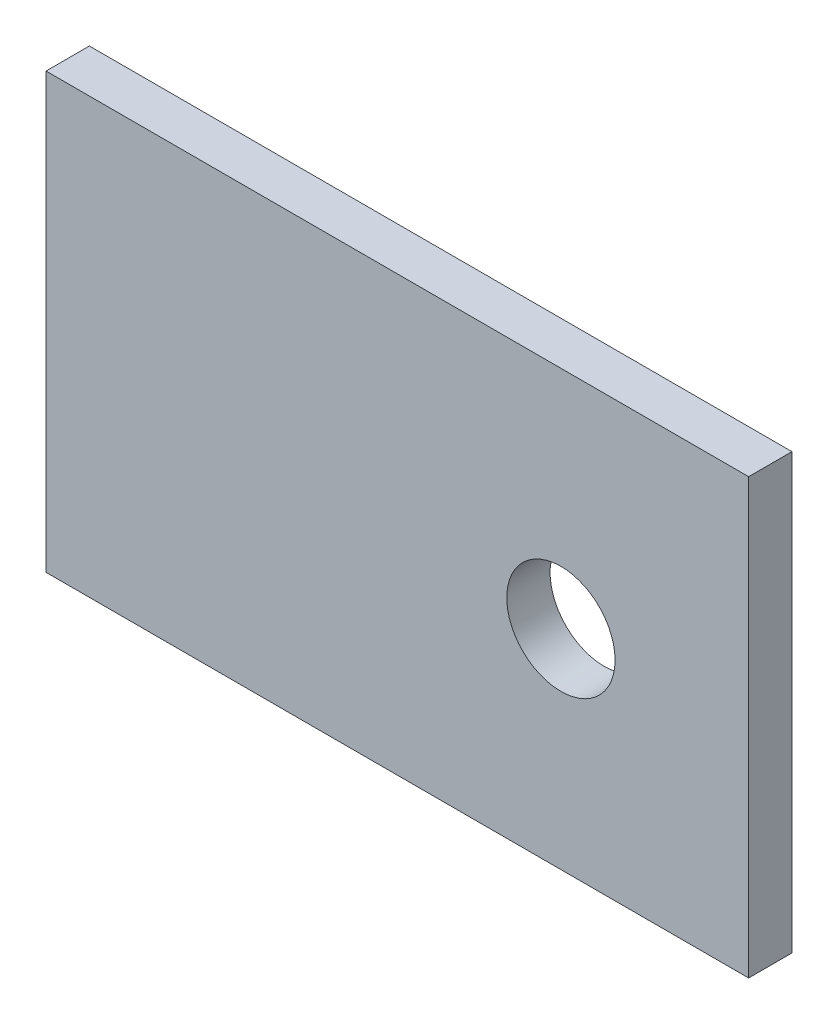
ISO-10303-21;
HEADER;
FILE_DESCRIPTION(('STEP AP214'),'2;1');
FILE_NAME('part.step','',(''),(''),'','','');
FILE_SCHEMA(('AUTOMOTIVE_DESIGN { 1 0 10303 214 1 1 1 1 }'));
ENDSEC;
DATA;
#1=APPLICATION_CONTEXT('core data for automotive mechanical design processes');
#2=APPLICATION_PROTOCOL_DEFINITION('international standard','automotive_design',2000,#1);
#3=PRODUCT_CONTEXT('',#1,'mechanical');
#4=PRODUCT('Part','Part','',(#3));
#5=PRODUCT_RELATED_PRODUCT_CATEGORY('part','',(#4));
#6=PRODUCT_DEFINITION_FORMATION('','',#4);
#7=PRODUCT_DEFINITION_CONTEXT('part definition',#1,'design');
#8=PRODUCT_DEFINITION('design','',#6,#7);
#9=PRODUCT_DEFINITION_SHAPE('','',#8);
#10=(LENGTH_UNIT() NAMED_UNIT(*) SI_UNIT(.MILLI.,.METRE.));
#11=(NAMED_UNIT(*) PLANE_ANGLE_UNIT() SI_UNIT($,.RADIAN.));
#12=(NAMED_UNIT(*) SI_UNIT($,.STERADIAN.) SOLID_ANGLE_UNIT());
#13=UNCERTAINTY_MEASURE_WITH_UNIT(LENGTH_MEASURE(1.E-05),#10,'distance_accuracy_value','');
#14=(GEOMETRIC_REPRESENTATION_CONTEXT(3) GLOBAL_UNCERTAINTY_ASSIGNED_CONTEXT((#13)) GLOBAL_UNIT_ASSIGNED_CONTEXT((#10,
#11,#12)) REPRESENTATION_CONTEXT('',''));
#15=CARTESIAN_POINT('',(0.,0.,0.));
#16=DIRECTION('',(0.,0.,1.));
#17=DIRECTION('',(1.,0.,0.));
#18=AXIS2_PLACEMENT_3D('',#15,#16,#17);
#19=CARTESIAN_POINT('',(0.,0.,2.));
#20=DIRECTION('',(0.,0.,1.));
#21=DIRECTION('',(1.,0.,0.));
#22=AXIS2_PLACEMENT_3D('',#19,#20,#21);
#23=PLANE('',#22);
#24=DIRECTION('',(0.,-1.,0.));
#25=VECTOR('',#24,1.);
#26=CARTESIAN_POINT('',(-23.7631255783567,10.4153482023236,2.));
#27=LINE('',#26,#25);
#28=CARTESIAN_POINT('',(-23.7631255783567,10.4153482023236,2.));
#29=VERTEX_POINT('',#28);
#30=CARTESIAN_POINT('',(-23.7631255783567,-9.62261241480205,2.));
#31=VERTEX_POINT('',#30);
#32=EDGE_CURVE('E85',#29,#31,#27,.T.);
#33=ORIENTED_EDGE('',*,*,#32,.T.);
#34=DIRECTION('',(1.,0.,0.));
#35=VECTOR('',#34,1.);
#36=CARTESIAN_POINT('',(-23.7631255783567,-9.62261241480205,2.));
#37=LINE('',#36,#35);
#38=CARTESIAN_POINT('',(8.66389671064778,-9.62261241480205,2.));
#39=VERTEX_POINT('',#38);
#40=EDGE_CURVE('E80',#31,#39,#37,.T.);
#41=ORIENTED_EDGE('',*,*,#40,.T.);
#42=DIRECTION('',(0.,1.,0.));
#43=VECTOR('',#42,1.);
#44=CARTESIAN_POINT('',(8.66389671064778,10.4153482023236,2.));
#45=LINE('',#44,#43);
#46=CARTESIAN_POINT('',(8.66389671064778,10.4153482023236,2.));
#47=VERTEX_POINT('',#46);
#48=EDGE_CURVE('E83',#39,#47,#45,.T.);
#49=ORIENTED_EDGE('',*,*,#48,.T.);
#50=DIRECTION('',(-1.,0.,0.));
#51=VECTOR('',#50,1.);
#52=CARTESIAN_POINT('',(-23.7631255783567,10.4153482023236,2.));
#53=LINE('',#52,#51);
#54=EDGE_CURVE('E50',#47,#29,#53,.T.);
#55=ORIENTED_EDGE('',*,*,#54,.T.);
#56=EDGE_LOOP('',(#33,#41,#49,#55));
#57=FACE_BOUND('',#56,.T.);
#58=CARTESIAN_POINT('',(0.,0.,2.));
#59=DIRECTION('',(0.,0.,1.));
#60=DIRECTION('',(1.,0.,0.));
#61=AXIS2_PLACEMENT_3D('',#58,#59,#60);
#62=CIRCLE('',#61,2.5);
#63=CARTESIAN_POINT('',(2.5,0.,2.));
#64=VERTEX_POINT('',#63);
#65=EDGE_CURVE('E100',#64,#64,#62,.T.);
#66=ORIENTED_EDGE('',*,*,#65,.F.);
#67=EDGE_LOOP('',(#66));
#68=FACE_BOUND('',#67,.T.);
#69=ADVANCED_FACE('F33',(#57,#68),#23,.T.);
#70=CARTESIAN_POINT('',(0.,0.,0.));
#71=DIRECTION('',(0.,0.,1.));
#72=DIRECTION('',(1.,0.,0.));
#73=AXIS2_PLACEMENT_3D('',#70,#71,#72);
#74=PLANE('',#73);
#75=DIRECTION('',(0.,-1.,0.));
#76=VECTOR('',#75,1.);
#77=CARTESIAN_POINT('',(-23.7631255783567,10.4153482023236,0.));
#78=LINE('',#77,#76);
#79=CARTESIAN_POINT('',(-23.7631255783567,10.4153482023236,0.));
#80=VERTEX_POINT('',#79);
#81=CARTESIAN_POINT('',(-23.7631255783567,-9.62261241480205,0.));
#82=VERTEX_POINT('',#81);
#83=EDGE_CURVE('E97',#80,#82,#78,.T.);
#84=ORIENTED_EDGE('',*,*,#83,.F.);
#85=DIRECTION('',(-1.,0.,0.));
#86=VECTOR('',#85,1.);
#87=CARTESIAN_POINT('',(-23.7631255783567,10.4153482023236,0.));
#88=LINE('',#87,#86);
#89=CARTESIAN_POINT('',(8.66389671064778,10.4153482023236,0.));
#90=VERTEX_POINT('',#89);
#91=EDGE_CURVE('E73',#90,#80,#88,.T.);
#92=ORIENTED_EDGE('',*,*,#91,.F.);
#93=DIRECTION('',(0.,1.,0.));
#94=VECTOR('',#93,1.);
#95=CARTESIAN_POINT('',(8.66389671064778,10.4153482023236,0.));
#96=LINE('',#95,#94);
#97=CARTESIAN_POINT('',(8.66389671064778,-9.62261241480205,0.));
#98=VERTEX_POINT('',#97);
#99=EDGE_CURVE('E67',#98,#90,#96,.T.);
#100=ORIENTED_EDGE('',*,*,#99,.F.);
#101=DIRECTION('',(1.,0.,0.));
#102=VECTOR('',#101,1.);
#103=CARTESIAN_POINT('',(-23.7631255783567,-9.62261241480205,0.));
#104=LINE('',#103,#102);
#105=EDGE_CURVE('E89',#82,#98,#104,.T.);
#106=ORIENTED_EDGE('',*,*,#105,.F.);
#107=EDGE_LOOP('',(#84,#92,#100,#106));
#108=FACE_BOUND('',#107,.T.);
#109=CARTESIAN_POINT('',(0.,0.,0.));
#110=DIRECTION('',(0.,0.,1.));
#111=DIRECTION('',(1.,0.,0.));
#112=AXIS2_PLACEMENT_3D('',#109,#110,#111);
#113=CIRCLE('',#112,2.5);
#114=CARTESIAN_POINT('',(2.5,0.,0.));
#115=VERTEX_POINT('',#114);
#116=EDGE_CURVE('E112',#115,#115,#113,.T.);
#117=ORIENTED_EDGE('',*,*,#116,.T.);
#118=EDGE_LOOP('',(#117));
#119=FACE_BOUND('',#118,.T.);
#120=ADVANCED_FACE('F108',(#108,#119),#74,.F.);
#121=CARTESIAN_POINT('',(-23.7631255783567,10.4153482023236,2.));
#122=DIRECTION('',(1.,0.,0.));
#123=DIRECTION('',(0.,0.,-1.));
#124=AXIS2_PLACEMENT_3D('',#121,#122,#123);
#125=PLANE('',#124);
#126=ORIENTED_EDGE('',*,*,#83,.T.);
#127=DIRECTION('',(0.,0.,-1.));
#128=VECTOR('',#127,1.);
#129=CARTESIAN_POINT('',(-23.7631255783567,-9.62261241480205,2.));
#130=LINE('',#129,#128);
#131=EDGE_CURVE('E11',#31,#82,#130,.T.);
#132=ORIENTED_EDGE('',*,*,#131,.F.);
#133=ORIENTED_EDGE('',*,*,#32,.F.);
#134=DIRECTION('',(0.,0.,-1.));
#135=VECTOR('',#134,1.);
#136=CARTESIAN_POINT('',(-23.7631255783567,10.4153482023236,2.));
#137=LINE('',#136,#135);
#138=EDGE_CURVE('E93',#29,#80,#137,.T.);
#139=ORIENTED_EDGE('',*,*,#138,.T.);
#140=EDGE_LOOP('',(#126,#132,#133,#139));
#141=FACE_BOUND('',#140,.T.);
#142=ADVANCED_FACE('F35',(#141),#125,.F.);
#143=CARTESIAN_POINT('',(-23.7631255783567,-9.62261241480205,2.));
#144=DIRECTION('',(0.,1.,0.));
#145=DIRECTION('',(0.,0.,1.));
#146=AXIS2_PLACEMENT_3D('',#143,#144,#145);
#147=PLANE('',#146);
#148=ORIENTED_EDGE('',*,*,#105,.T.);
#149=DIRECTION('',(0.,0.,-1.));
#150=VECTOR('',#149,1.);
#151=CARTESIAN_POINT('',(8.66389671064778,-9.62261241480205,2.));
#152=LINE('',#151,#150);
#153=EDGE_CURVE('E42',#39,#98,#152,.T.);
#154=ORIENTED_EDGE('',*,*,#153,.F.);
#155=ORIENTED_EDGE('',*,*,#40,.F.);
#156=ORIENTED_EDGE('',*,*,#131,.T.);
#157=EDGE_LOOP('',(#148,#154,#155,#156));
#158=FACE_BOUND('',#157,.T.);
#159=ADVANCED_FACE('F88',(#158),#147,.F.);
#160=CARTESIAN_POINT('',(8.66389671064778,10.4153482023236,2.));
#161=DIRECTION('',(-1.,0.,0.));
#162=DIRECTION('',(0.,-1.,0.));
#163=AXIS2_PLACEMENT_3D('',#160,#161,#162);
#164=PLANE('',#163);
#165=ORIENTED_EDGE('',*,*,#99,.T.);
#166=DIRECTION('',(0.,0.,-1.));
#167=VECTOR('',#166,1.);
#168=CARTESIAN_POINT('',(8.66389671064778,10.4153482023236,2.));
#169=LINE('',#168,#167);
#170=EDGE_CURVE('E90',#47,#90,#169,.T.);
#171=ORIENTED_EDGE('',*,*,#170,.F.);
#172=ORIENTED_EDGE('',*,*,#48,.F.);
#173=ORIENTED_EDGE('',*,*,#153,.T.);
#174=EDGE_LOOP('',(#165,#171,#172,#173));
#175=FACE_BOUND('',#174,.T.);
#176=ADVANCED_FACE('F91',(#175),#164,.F.);
#177=CARTESIAN_POINT('',(-23.7631255783567,10.4153482023236,2.));
#178=DIRECTION('',(0.,-1.,0.));
#179=DIRECTION('',(0.,0.,-1.));
#180=AXIS2_PLACEMENT_3D('',#177,#178,#179);
#181=PLANE('',#180);
#182=ORIENTED_EDGE('',*,*,#91,.T.);
#183=ORIENTED_EDGE('',*,*,#138,.F.);
#184=ORIENTED_EDGE('',*,*,#54,.F.);
#185=ORIENTED_EDGE('',*,*,#170,.T.);
#186=EDGE_LOOP('',(#182,#183,#184,#185));
#187=FACE_BOUND('',#186,.T.);
#188=ADVANCED_FACE('F105',(#187),#181,.F.);
#189=CARTESIAN_POINT('',(0.,0.,2.));
#190=DIRECTION('',(0.,0.,-1.));
#191=DIRECTION('',(-1.,0.,0.));
#192=AXIS2_PLACEMENT_3D('',#189,#190,#191);
#193=CYLINDRICAL_SURFACE('',#192,2.5);
#194=ORIENTED_EDGE('',*,*,#65,.T.);
#195=EDGE_LOOP('',(#194));
#196=FACE_BOUND('',#195,.T.);
#197=ORIENTED_EDGE('',*,*,#116,.F.);
#198=EDGE_LOOP('',(#197));
#199=FACE_BOUND('',#198,.T.);
#200=ADVANCED_FACE('F118',(#196,#199),#193,.F.);
#201=CLOSED_SHELL('',(#69,#120,#142,#159,#176,#188,#200));
#202=MANIFOLD_SOLID_BREP('B2',#201);
#203=ADVANCED_BREP_SHAPE_REPRESENTATION('',(#18,#202),#14);
#204=SHAPE_DEFINITION_REPRESENTATION(#9,#203);
ENDSEC;
END-ISO-10303-21;
